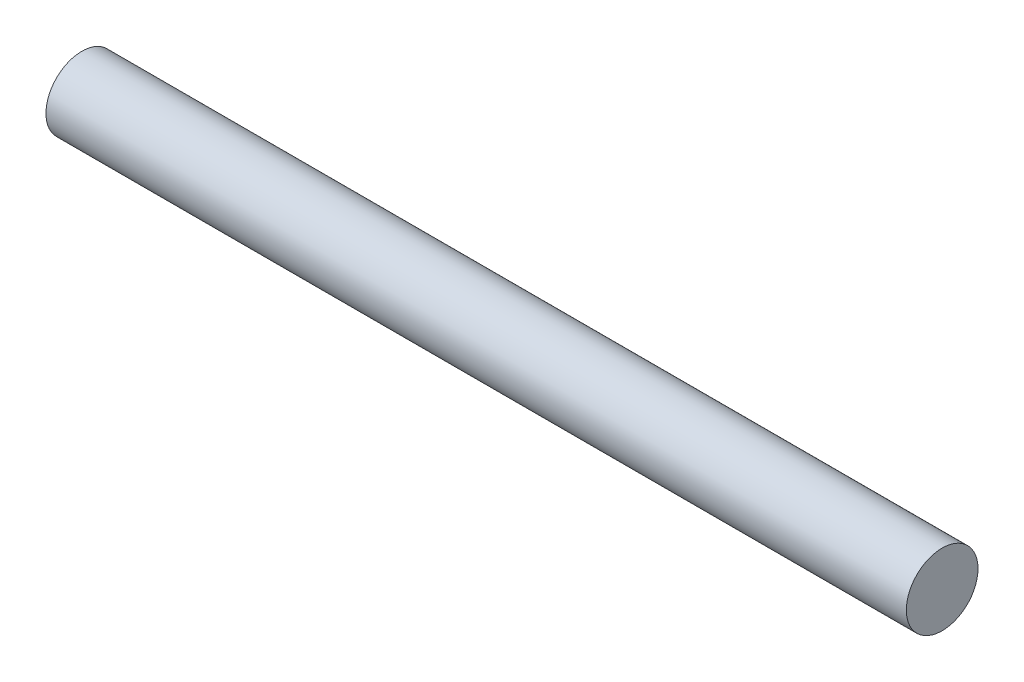
ISO-10303-21;
HEADER;
FILE_DESCRIPTION(('STEP AP214'),'2;1');
FILE_NAME('part.step','',(''),(''),'','','');
FILE_SCHEMA(('AUTOMOTIVE_DESIGN { 1 0 10303 214 1 1 1 1 }'));
ENDSEC;
DATA;
#1=APPLICATION_CONTEXT('core data for automotive mechanical design processes');
#2=APPLICATION_PROTOCOL_DEFINITION('international standard','automotive_design',2000,#1);
#3=PRODUCT_CONTEXT('',#1,'mechanical');
#4=PRODUCT('Part','Part','',(#3));
#5=PRODUCT_RELATED_PRODUCT_CATEGORY('part','',(#4));
#6=PRODUCT_DEFINITION_FORMATION('','',#4);
#7=PRODUCT_DEFINITION_CONTEXT('part definition',#1,'design');
#8=PRODUCT_DEFINITION('design','',#6,#7);
#9=PRODUCT_DEFINITION_SHAPE('','',#8);
#10=(LENGTH_UNIT() NAMED_UNIT(*) SI_UNIT(.MILLI.,.METRE.));
#11=(NAMED_UNIT(*) PLANE_ANGLE_UNIT() SI_UNIT($,.RADIAN.));
#12=(NAMED_UNIT(*) SI_UNIT($,.STERADIAN.) SOLID_ANGLE_UNIT());
#13=UNCERTAINTY_MEASURE_WITH_UNIT(LENGTH_MEASURE(1.E-05),#10,'distance_accuracy_value','');
#14=(GEOMETRIC_REPRESENTATION_CONTEXT(3) GLOBAL_UNCERTAINTY_ASSIGNED_CONTEXT((#13)) GLOBAL_UNIT_ASSIGNED_CONTEXT((#10,
#11,#12)) REPRESENTATION_CONTEXT('',''));
#15=CARTESIAN_POINT('',(0.,0.,0.));
#16=DIRECTION('',(0.,0.,1.));
#17=DIRECTION('',(1.,0.,0.));
#18=AXIS2_PLACEMENT_3D('',#15,#16,#17);
#19=CARTESIAN_POINT('',(28.575,0.,0.));
#20=DIRECTION('',(-1.,0.,0.));
#21=DIRECTION('',(0.,0.,1.));
#22=AXIS2_PLACEMENT_3D('',#19,#20,#21);
#23=CYLINDRICAL_SURFACE('',#22,2.38125);
#24=CARTESIAN_POINT('',(28.575,0.,0.));
#25=DIRECTION('',(1.,0.,0.));
#26=DIRECTION('',(0.,0.,-1.));
#27=AXIS2_PLACEMENT_3D('',#24,#25,#26);
#28=CIRCLE('',#27,2.38125);
#29=CARTESIAN_POINT('',(28.575,0.,-2.38125));
#30=VERTEX_POINT('',#29);
#31=EDGE_CURVE('E10',#30,#30,#28,.T.);
#32=ORIENTED_EDGE('',*,*,#31,.F.);
#33=EDGE_LOOP('',(#32));
#34=FACE_BOUND('',#33,.T.);
#35=CARTESIAN_POINT('',(-28.575,0.,0.));
#36=DIRECTION('',(1.,0.,0.));
#37=DIRECTION('',(0.,0.,-1.));
#38=AXIS2_PLACEMENT_3D('',#35,#36,#37);
#39=CIRCLE('',#38,2.38125);
#40=CARTESIAN_POINT('',(-28.575,0.,-2.38125));
#41=VERTEX_POINT('',#40);
#42=EDGE_CURVE('E45',#41,#41,#39,.T.);
#43=ORIENTED_EDGE('',*,*,#42,.T.);
#44=EDGE_LOOP('',(#43));
#45=FACE_BOUND('',#44,.T.);
#46=ADVANCED_FACE('F39',(#34,#45),#23,.T.);
#47=CARTESIAN_POINT('',(28.575,0.,0.));
#48=DIRECTION('',(1.,0.,0.));
#49=DIRECTION('',(0.,0.,-1.));
#50=AXIS2_PLACEMENT_3D('',#47,#48,#49);
#51=PLANE('',#50);
#52=ORIENTED_EDGE('',*,*,#31,.T.);
#53=EDGE_LOOP('',(#52));
#54=FACE_BOUND('',#53,.T.);
#55=ADVANCED_FACE('F53',(#54),#51,.T.);
#56=CARTESIAN_POINT('',(-28.575,0.,0.));
#57=DIRECTION('',(1.,0.,0.));
#58=DIRECTION('',(0.,0.,-1.));
#59=AXIS2_PLACEMENT_3D('',#56,#57,#58);
#60=PLANE('',#59);
#61=ORIENTED_EDGE('',*,*,#42,.F.);
#62=EDGE_LOOP('',(#61));
#63=FACE_BOUND('',#62,.T.);
#64=ADVANCED_FACE('F55',(#63),#60,.F.);
#65=CLOSED_SHELL('',(#46,#55,#64));
#66=MANIFOLD_SOLID_BREP('B2',#65);
#67=ADVANCED_BREP_SHAPE_REPRESENTATION('',(#18,#66),#14);
#68=SHAPE_DEFINITION_REPRESENTATION(#9,#67);
ENDSEC;
END-ISO-10303-21;
